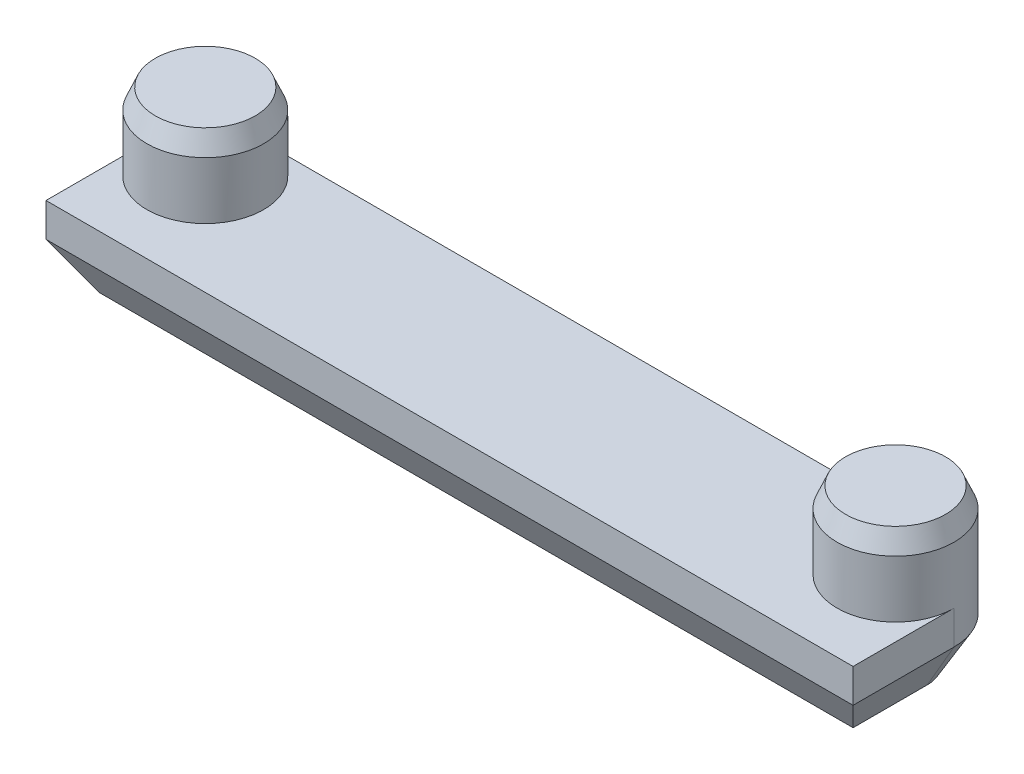
ISO-10303-21;
HEADER;
FILE_DESCRIPTION(('STEP AP214'),'2;1');
FILE_NAME('part.step','',(''),(''),'','','');
FILE_SCHEMA(('AUTOMOTIVE_DESIGN { 1 0 10303 214 1 1 1 1 }'));
ENDSEC;
DATA;
#1=APPLICATION_CONTEXT('core data for automotive mechanical design processes');
#2=APPLICATION_PROTOCOL_DEFINITION('international standard','automotive_design',2000,#1);
#3=PRODUCT_CONTEXT('',#1,'mechanical');
#4=PRODUCT('Part','Part','',(#3));
#5=PRODUCT_RELATED_PRODUCT_CATEGORY('part','',(#4));
#6=PRODUCT_DEFINITION_FORMATION('','',#4);
#7=PRODUCT_DEFINITION_CONTEXT('part definition',#1,'design');
#8=PRODUCT_DEFINITION('design','',#6,#7);
#9=PRODUCT_DEFINITION_SHAPE('','',#8);
#10=(LENGTH_UNIT() NAMED_UNIT(*) SI_UNIT(.MILLI.,.METRE.));
#11=(NAMED_UNIT(*) PLANE_ANGLE_UNIT() SI_UNIT($,.RADIAN.));
#12=(NAMED_UNIT(*) SI_UNIT($,.STERADIAN.) SOLID_ANGLE_UNIT());
#13=UNCERTAINTY_MEASURE_WITH_UNIT(LENGTH_MEASURE(1.E-05),#10,'distance_accuracy_value','');
#14=(GEOMETRIC_REPRESENTATION_CONTEXT(3) GLOBAL_UNCERTAINTY_ASSIGNED_CONTEXT((#13)) GLOBAL_UNIT_ASSIGNED_CONTEXT((#10,
#11,#12)) REPRESENTATION_CONTEXT('',''));
#15=CARTESIAN_POINT('',(0.,0.,0.));
#16=DIRECTION('',(0.,0.,1.));
#17=DIRECTION('',(1.,0.,0.));
#18=AXIS2_PLACEMENT_3D('',#15,#16,#17);
#19=CARTESIAN_POINT('',(30.4,3.,0.));
#20=DIRECTION('',(-1.,0.,0.));
#21=DIRECTION('',(0.,0.,1.));
#22=AXIS2_PLACEMENT_3D('',#19,#20,#21);
#23=PLANE('',#22);
#24=DIRECTION('',(0.,-1.,0.));
#25=VECTOR('',#24,1.);
#26=CARTESIAN_POINT('',(30.4,3.,0.));
#27=LINE('',#26,#25);
#28=CARTESIAN_POINT('',(30.4,3.,0.));
#29=VERTEX_POINT('',#28);
#30=CARTESIAN_POINT('',(30.4,1.73205080756888,0.));
#31=VERTEX_POINT('',#30);
#32=EDGE_CURVE('E200',#29,#31,#27,.T.);
#33=ORIENTED_EDGE('',*,*,#32,.T.);
#34=DIRECTION('',(0.,0.,-1.));
#35=VECTOR('',#34,1.);
#36=CARTESIAN_POINT('',(30.4,1.73205080756888,-3.8));
#37=LINE('',#36,#35);
#38=CARTESIAN_POINT('',(30.4,1.73205080756888,-3.8));
#39=VERTEX_POINT('',#38);
#40=EDGE_CURVE('E116',#31,#39,#37,.T.);
#41=ORIENTED_EDGE('',*,*,#40,.T.);
#42=DIRECTION('',(0.,1.,0.));
#43=VECTOR('',#42,1.);
#44=CARTESIAN_POINT('',(30.4,0.,-3.8));
#45=LINE('',#44,#43);
#46=CARTESIAN_POINT('',(30.4,3.,-3.8));
#47=VERTEX_POINT('',#46);
#48=EDGE_CURVE('E111',#39,#47,#45,.T.);
#49=ORIENTED_EDGE('',*,*,#48,.T.);
#50=DIRECTION('',(0.,0.,-1.));
#51=VECTOR('',#50,1.);
#52=CARTESIAN_POINT('',(30.4,3.,0.));
#53=LINE('',#52,#51);
#54=EDGE_CURVE('E114',#29,#47,#53,.T.);
#55=ORIENTED_EDGE('',*,*,#54,.F.);
#56=EDGE_LOOP('',(#33,#41,#49,#55));
#57=FACE_BOUND('',#56,.T.);
#58=ADVANCED_FACE('F40',(#57),#23,.F.);
#59=CARTESIAN_POINT('',(0.,3.,-6.));
#60=DIRECTION('',(0.,0.,1.));
#61=DIRECTION('',(1.,0.,0.));
#62=AXIS2_PLACEMENT_3D('',#59,#60,#61);
#63=PLANE('',#62);
#64=DIRECTION('',(0.,1.,0.));
#65=VECTOR('',#64,1.);
#66=CARTESIAN_POINT('',(28.2,0.,-6.));
#67=LINE('',#66,#65);
#68=CARTESIAN_POINT('',(28.2,1.73205080756888,-6.));
#69=VERTEX_POINT('',#68);
#70=CARTESIAN_POINT('',(28.2,3.,-6.));
#71=VERTEX_POINT('',#70);
#72=EDGE_CURVE('E118',#69,#71,#67,.T.);
#73=ORIENTED_EDGE('',*,*,#72,.F.);
#74=DIRECTION('',(-1.,0.,0.));
#75=VECTOR('',#74,1.);
#76=CARTESIAN_POINT('',(2.2,1.73205080756888,-6.));
#77=LINE('',#76,#75);
#78=CARTESIAN_POINT('',(2.2,1.73205080756888,-6.));
#79=VERTEX_POINT('',#78);
#80=EDGE_CURVE('E11',#69,#79,#77,.T.);
#81=ORIENTED_EDGE('',*,*,#80,.T.);
#82=DIRECTION('',(0.,1.,0.));
#83=VECTOR('',#82,1.);
#84=CARTESIAN_POINT('',(2.2,0.,-6.));
#85=LINE('',#84,#83);
#86=CARTESIAN_POINT('',(2.2,3.,-6.));
#87=VERTEX_POINT('',#86);
#88=EDGE_CURVE('E189',#79,#87,#85,.T.);
#89=ORIENTED_EDGE('',*,*,#88,.T.);
#90=DIRECTION('',(-1.,0.,0.));
#91=VECTOR('',#90,1.);
#92=CARTESIAN_POINT('',(0.,3.,-6.));
#93=LINE('',#92,#91);
#94=EDGE_CURVE('E129',#71,#87,#93,.T.);
#95=ORIENTED_EDGE('',*,*,#94,.F.);
#96=EDGE_LOOP('',(#73,#81,#89,#95));
#97=FACE_BOUND('',#96,.T.);
#98=ADVANCED_FACE('F233',(#97),#63,.F.);
#99=CARTESIAN_POINT('',(0.,3.,0.));
#100=DIRECTION('',(0.,-1.,0.));
#101=DIRECTION('',(0.,0.,-1.));
#102=AXIS2_PLACEMENT_3D('',#99,#100,#101);
#103=PLANE('',#102);
#104=CARTESIAN_POINT('',(28.2,3.,-3.8));
#105=DIRECTION('',(0.,-1.,0.));
#106=DIRECTION('',(0.,0.,-1.));
#107=AXIS2_PLACEMENT_3D('',#104,#105,#106);
#108=CIRCLE('',#107,2.2);
#109=EDGE_CURVE('E125',#71,#47,#108,.F.);
#110=ORIENTED_EDGE('',*,*,#109,.F.);
#111=ORIENTED_EDGE('',*,*,#94,.T.);
#112=CARTESIAN_POINT('',(2.2,3.,-3.8));
#113=DIRECTION('',(0.,1.,0.));
#114=DIRECTION('',(0.,0.,1.));
#115=AXIS2_PLACEMENT_3D('',#112,#113,#114);
#116=CIRCLE('',#115,2.2);
#117=CARTESIAN_POINT('',(0.,3.,-3.8));
#118=VERTEX_POINT('',#117);
#119=EDGE_CURVE('E134',#118,#87,#116,.T.);
#120=ORIENTED_EDGE('',*,*,#119,.F.);
#121=DIRECTION('',(0.,0.,1.));
#122=VECTOR('',#121,1.);
#123=CARTESIAN_POINT('',(0.,3.,0.));
#124=LINE('',#123,#122);
#125=CARTESIAN_POINT('',(0.,3.,0.));
#126=VERTEX_POINT('',#125);
#127=EDGE_CURVE('E197',#118,#126,#124,.T.);
#128=ORIENTED_EDGE('',*,*,#127,.T.);
#129=DIRECTION('',(1.,0.,0.));
#130=VECTOR('',#129,1.);
#131=CARTESIAN_POINT('',(0.,3.,0.));
#132=LINE('',#131,#130);
#133=EDGE_CURVE('E127',#126,#29,#132,.T.);
#134=ORIENTED_EDGE('',*,*,#133,.T.);
#135=ORIENTED_EDGE('',*,*,#54,.T.);
#136=EDGE_LOOP('',(#110,#111,#120,#128,#134,#135));
#137=FACE_BOUND('',#136,.T.);
#138=ADVANCED_FACE('F123',(#137),#103,.F.);
#139=CARTESIAN_POINT('',(0.,3.,0.));
#140=DIRECTION('',(1.,0.,0.));
#141=DIRECTION('',(0.,0.,-1.));
#142=AXIS2_PLACEMENT_3D('',#139,#140,#141);
#143=PLANE('',#142);
#144=DIRECTION('',(0.,1.,0.));
#145=VECTOR('',#144,1.);
#146=CARTESIAN_POINT('',(0.,0.,-3.8));
#147=LINE('',#146,#145);
#148=CARTESIAN_POINT('',(0.,1.73205080756888,-3.8));
#149=VERTEX_POINT('',#148);
#150=EDGE_CURVE('E119',#149,#118,#147,.T.);
#151=ORIENTED_EDGE('',*,*,#150,.F.);
#152=DIRECTION('',(0.,0.,1.));
#153=VECTOR('',#152,1.);
#154=CARTESIAN_POINT('',(0.,1.73205080756888,0.));
#155=LINE('',#154,#153);
#156=CARTESIAN_POINT('',(0.,1.73205080756888,0.));
#157=VERTEX_POINT('',#156);
#158=EDGE_CURVE('E170',#149,#157,#155,.T.);
#159=ORIENTED_EDGE('',*,*,#158,.T.);
#160=DIRECTION('',(0.,-1.,0.));
#161=VECTOR('',#160,1.);
#162=CARTESIAN_POINT('',(0.,3.,0.));
#163=LINE('',#162,#161);
#164=EDGE_CURVE('E140',#126,#157,#163,.T.);
#165=ORIENTED_EDGE('',*,*,#164,.F.);
#166=ORIENTED_EDGE('',*,*,#127,.F.);
#167=EDGE_LOOP('',(#151,#159,#165,#166));
#168=FACE_BOUND('',#167,.T.);
#169=ADVANCED_FACE('F232',(#168),#143,.F.);
#170=CARTESIAN_POINT('',(0.,3.,0.));
#171=DIRECTION('',(0.,0.,-1.));
#172=DIRECTION('',(-1.,0.,0.));
#173=AXIS2_PLACEMENT_3D('',#170,#171,#172);
#174=PLANE('',#173);
#175=ORIENTED_EDGE('',*,*,#164,.T.);
#176=DIRECTION('',(1.,0.,0.));
#177=VECTOR('',#176,1.);
#178=CARTESIAN_POINT('',(30.4,1.73205080756888,0.));
#179=LINE('',#178,#177);
#180=EDGE_CURVE('E153',#157,#31,#179,.T.);
#181=ORIENTED_EDGE('',*,*,#180,.T.);
#182=ORIENTED_EDGE('',*,*,#32,.F.);
#183=ORIENTED_EDGE('',*,*,#133,.F.);
#184=EDGE_LOOP('',(#175,#181,#182,#183));
#185=FACE_BOUND('',#184,.T.);
#186=ADVANCED_FACE('F205',(#185),#174,.F.);
#187=CARTESIAN_POINT('',(0.,0.,0.));
#188=DIRECTION('',(0.,-1.,0.));
#189=DIRECTION('',(0.,0.,-1.));
#190=AXIS2_PLACEMENT_3D('',#187,#188,#189);
#191=PLANE('',#190);
#192=DIRECTION('',(0.,0.,1.));
#193=VECTOR('',#192,1.);
#194=CARTESIAN_POINT('',(29.4,0.,0.));
#195=LINE('',#194,#193);
#196=CARTESIAN_POINT('',(29.4,0.,-3.8));
#197=VERTEX_POINT('',#196);
#198=CARTESIAN_POINT('',(29.4,0.,-1.));
#199=VERTEX_POINT('',#198);
#200=EDGE_CURVE('E164',#197,#199,#195,.T.);
#201=ORIENTED_EDGE('',*,*,#200,.T.);
#202=DIRECTION('',(-1.,0.,0.));
#203=VECTOR('',#202,1.);
#204=CARTESIAN_POINT('',(0.,0.,-1.));
#205=LINE('',#204,#203);
#206=CARTESIAN_POINT('',(1.,0.,-1.));
#207=VERTEX_POINT('',#206);
#208=EDGE_CURVE('E166',#199,#207,#205,.T.);
#209=ORIENTED_EDGE('',*,*,#208,.T.);
#210=DIRECTION('',(0.,0.,-1.));
#211=VECTOR('',#210,1.);
#212=CARTESIAN_POINT('',(1.,0.,-3.8));
#213=LINE('',#212,#211);
#214=CARTESIAN_POINT('',(1.,0.,-3.8));
#215=VERTEX_POINT('',#214);
#216=EDGE_CURVE('E162',#207,#215,#213,.T.);
#217=ORIENTED_EDGE('',*,*,#216,.T.);
#218=CARTESIAN_POINT('',(2.2,0.,-3.8));
#219=DIRECTION('',(0.,-1.,0.));
#220=DIRECTION('',(0.,0.,-1.));
#221=AXIS2_PLACEMENT_3D('',#218,#219,#220);
#222=CIRCLE('',#221,1.2);
#223=CARTESIAN_POINT('',(2.2,0.,-5.));
#224=VERTEX_POINT('',#223);
#225=EDGE_CURVE('E158',#215,#224,#222,.T.);
#226=ORIENTED_EDGE('',*,*,#225,.T.);
#227=DIRECTION('',(1.,0.,0.));
#228=VECTOR('',#227,1.);
#229=CARTESIAN_POINT('',(28.2,0.,-5.));
#230=LINE('',#229,#228);
#231=CARTESIAN_POINT('',(28.2,0.,-5.));
#232=VERTEX_POINT('',#231);
#233=EDGE_CURVE('E156',#224,#232,#230,.T.);
#234=ORIENTED_EDGE('',*,*,#233,.T.);
#235=CARTESIAN_POINT('',(28.2,0.,-3.8));
#236=DIRECTION('',(0.,-1.,0.));
#237=DIRECTION('',(0.,0.,-1.));
#238=AXIS2_PLACEMENT_3D('',#235,#236,#237);
#239=CIRCLE('',#238,1.19999999999999);
#240=EDGE_CURVE('E160',#232,#197,#239,.T.);
#241=ORIENTED_EDGE('',*,*,#240,.T.);
#242=EDGE_LOOP('',(#201,#209,#217,#226,#234,#241));
#243=FACE_BOUND('',#242,.T.);
#244=ADVANCED_FACE('F223',(#243),#191,.T.);
#245=CARTESIAN_POINT('',(2.2,5.9,-3.8));
#246=DIRECTION('',(0.,-1.,0.));
#247=DIRECTION('',(0.,0.,-1.));
#248=AXIS2_PLACEMENT_3D('',#245,#246,#247);
#249=CYLINDRICAL_SURFACE('',#248,2.2);
#250=CARTESIAN_POINT('',(2.2,5.14999999999997,-3.8));
#251=DIRECTION('',(0.,1.,0.));
#252=DIRECTION('',(0.,0.,1.));
#253=AXIS2_PLACEMENT_3D('',#250,#251,#252);
#254=CIRCLE('',#253,2.2);
#255=CARTESIAN_POINT('',(2.2,5.14999999999997,-1.6));
#256=VERTEX_POINT('',#255);
#257=EDGE_CURVE('E150',#256,#256,#254,.F.);
#258=ORIENTED_EDGE('',*,*,#257,.T.);
#259=EDGE_LOOP('',(#258));
#260=FACE_BOUND('',#259,.T.);
#261=ORIENTED_EDGE('',*,*,#88,.F.);
#262=CARTESIAN_POINT('',(2.2,1.73205080756888,-3.8));
#263=DIRECTION('',(0.,-1.,0.));
#264=DIRECTION('',(0.,0.,-1.));
#265=AXIS2_PLACEMENT_3D('',#262,#263,#264);
#266=CIRCLE('',#265,2.2);
#267=EDGE_CURVE('E49',#79,#149,#266,.F.);
#268=ORIENTED_EDGE('',*,*,#267,.T.);
#269=ORIENTED_EDGE('',*,*,#150,.T.);
#270=ORIENTED_EDGE('',*,*,#119,.T.);
#271=EDGE_LOOP('',(#261,#268,#269,#270));
#272=FACE_BOUND('',#271,.T.);
#273=ADVANCED_FACE('F230',(#260,#272),#249,.T.);
#274=CARTESIAN_POINT('',(2.2,5.9,-3.8));
#275=DIRECTION('',(0.,1.,0.));
#276=DIRECTION('',(0.,0.,1.));
#277=AXIS2_PLACEMENT_3D('',#274,#275,#276);
#278=PLANE('',#277);
#279=CARTESIAN_POINT('',(2.2,5.9,-3.8));
#280=DIRECTION('',(0.,1.,0.));
#281=DIRECTION('',(0.,0.,1.));
#282=AXIS2_PLACEMENT_3D('',#279,#280,#281);
#283=CIRCLE('',#282,1.88164388784279);
#284=CARTESIAN_POINT('',(2.2,5.9,-1.91835611215721));
#285=VERTEX_POINT('',#284);
#286=EDGE_CURVE('E147',#285,#285,#283,.T.);
#287=ORIENTED_EDGE('',*,*,#286,.T.);
#288=EDGE_LOOP('',(#287));
#289=FACE_BOUND('',#288,.T.);
#290=ADVANCED_FACE('F294',(#289),#278,.T.);
#291=CARTESIAN_POINT('',(28.2,5.9,-3.8));
#292=DIRECTION('',(0.,-1.,0.));
#293=DIRECTION('',(0.,0.,-1.));
#294=AXIS2_PLACEMENT_3D('',#291,#292,#293);
#295=CYLINDRICAL_SURFACE('',#294,2.2);
#296=CARTESIAN_POINT('',(28.2,5.14999999999998,-3.8));
#297=DIRECTION('',(0.,1.,0.));
#298=DIRECTION('',(0.,0.,1.));
#299=AXIS2_PLACEMENT_3D('',#296,#297,#298);
#300=CIRCLE('',#299,2.2);
#301=CARTESIAN_POINT('',(28.2,5.14999999999998,-1.6));
#302=VERTEX_POINT('',#301);
#303=EDGE_CURVE('E137',#302,#302,#300,.F.);
#304=ORIENTED_EDGE('',*,*,#303,.T.);
#305=EDGE_LOOP('',(#304));
#306=FACE_BOUND('',#305,.T.);
#307=ORIENTED_EDGE('',*,*,#48,.F.);
#308=CARTESIAN_POINT('',(28.2,1.73205080756888,-3.8));
#309=DIRECTION('',(0.,-1.,0.));
#310=DIRECTION('',(0.,0.,-1.));
#311=AXIS2_PLACEMENT_3D('',#308,#309,#310);
#312=CIRCLE('',#311,2.2);
#313=EDGE_CURVE('E63',#39,#69,#312,.F.);
#314=ORIENTED_EDGE('',*,*,#313,.T.);
#315=ORIENTED_EDGE('',*,*,#72,.T.);
#316=ORIENTED_EDGE('',*,*,#109,.T.);
#317=EDGE_LOOP('',(#307,#314,#315,#316));
#318=FACE_BOUND('',#317,.T.);
#319=ADVANCED_FACE('F131',(#306,#318),#295,.T.);
#320=CARTESIAN_POINT('',(28.2,5.9,-3.8));
#321=DIRECTION('',(0.,1.,0.));
#322=DIRECTION('',(0.,0.,1.));
#323=AXIS2_PLACEMENT_3D('',#320,#321,#322);
#324=PLANE('',#323);
#325=CARTESIAN_POINT('',(28.2,5.9,-3.8));
#326=DIRECTION('',(0.,1.,0.));
#327=DIRECTION('',(0.,0.,1.));
#328=AXIS2_PLACEMENT_3D('',#325,#326,#327);
#329=CIRCLE('',#328,1.88164388784279);
#330=CARTESIAN_POINT('',(28.2,5.9,-1.91835611215721));
#331=VERTEX_POINT('',#330);
#332=EDGE_CURVE('E133',#331,#331,#329,.T.);
#333=ORIENTED_EDGE('',*,*,#332,.T.);
#334=EDGE_LOOP('',(#333));
#335=FACE_BOUND('',#334,.T.);
#336=ADVANCED_FACE('F253',(#335),#324,.T.);
#337=CARTESIAN_POINT('',(28.2,5.9,-3.8));
#338=DIRECTION('',(0.,-1.,0.));
#339=DIRECTION('',(0.,0.,-1.));
#340=AXIS2_PLACEMENT_3D('',#337,#338,#339);
#341=CONICAL_SURFACE('',#340,1.88164388784279,0.401425727958693);
#342=ORIENTED_EDGE('',*,*,#303,.F.);
#343=EDGE_LOOP('',(#342));
#344=FACE_BOUND('',#343,.T.);
#345=ORIENTED_EDGE('',*,*,#332,.F.);
#346=EDGE_LOOP('',(#345));
#347=FACE_BOUND('',#346,.T.);
#348=ADVANCED_FACE('F249',(#344,#347),#341,.T.);
#349=CARTESIAN_POINT('',(2.2,5.9,-3.8));
#350=DIRECTION('',(0.,-1.,0.));
#351=DIRECTION('',(0.,0.,-1.));
#352=AXIS2_PLACEMENT_3D('',#349,#350,#351);
#353=CONICAL_SURFACE('',#352,1.88164388784279,0.401425727958692);
#354=ORIENTED_EDGE('',*,*,#257,.F.);
#355=EDGE_LOOP('',(#354));
#356=FACE_BOUND('',#355,.T.);
#357=ORIENTED_EDGE('',*,*,#286,.F.);
#358=EDGE_LOOP('',(#357));
#359=FACE_BOUND('',#358,.T.);
#360=ADVANCED_FACE('F252',(#356,#359),#353,.T.);
#361=CARTESIAN_POINT('',(0.,1.73205080756888,-6.));
#362=DIRECTION('',(0.,-0.500000000000001,-0.866025403784438));
#363=DIRECTION('',(1.,0.,0.));
#364=AXIS2_PLACEMENT_3D('',#361,#362,#363);
#365=PLANE('',#364);
#366=DIRECTION('',(0.,0.866025403784438,-0.500000000000001));
#367=VECTOR('',#366,1.);
#368=CARTESIAN_POINT('',(28.2,0.,-5.));
#369=LINE('',#368,#367);
#370=EDGE_CURVE('E183',#232,#69,#369,.T.);
#371=ORIENTED_EDGE('',*,*,#370,.F.);
#372=ORIENTED_EDGE('',*,*,#233,.F.);
#373=DIRECTION('',(0.,-0.866025403784438,0.500000000000001));
#374=VECTOR('',#373,1.);
#375=CARTESIAN_POINT('',(2.2,1.73205080756888,-6.));
#376=LINE('',#375,#374);
#377=EDGE_CURVE('E44',#79,#224,#376,.T.);
#378=ORIENTED_EDGE('',*,*,#377,.F.);
#379=ORIENTED_EDGE('',*,*,#80,.F.);
#380=EDGE_LOOP('',(#371,#372,#378,#379));
#381=FACE_BOUND('',#380,.T.);
#382=ADVANCED_FACE('F42',(#381),#365,.T.);
#383=CARTESIAN_POINT('',(2.2,0.,-3.8));
#384=DIRECTION('',(0.,1.,0.));
#385=DIRECTION('',(0.,0.,1.));
#386=AXIS2_PLACEMENT_3D('',#383,#384,#385);
#387=CONICAL_SURFACE('',#386,1.2,0.523598775598301);
#388=ORIENTED_EDGE('',*,*,#377,.T.);
#389=ORIENTED_EDGE('',*,*,#225,.F.);
#390=DIRECTION('',(0.500000000000002,-0.866025403784438,0.));
#391=VECTOR('',#390,1.);
#392=CARTESIAN_POINT('',(0.,1.73205080756888,-3.8));
#393=LINE('',#392,#391);
#394=EDGE_CURVE('E181',#149,#215,#393,.T.);
#395=ORIENTED_EDGE('',*,*,#394,.F.);
#396=ORIENTED_EDGE('',*,*,#267,.F.);
#397=EDGE_LOOP('',(#388,#389,#395,#396));
#398=FACE_BOUND('',#397,.T.);
#399=ADVANCED_FACE('F227',(#398),#387,.T.);
#400=CARTESIAN_POINT('',(28.2,0.,-3.8));
#401=DIRECTION('',(0.,1.,0.));
#402=DIRECTION('',(0.,0.,1.));
#403=AXIS2_PLACEMENT_3D('',#400,#401,#402);
#404=CONICAL_SURFACE('',#403,1.19999999999999,0.523598775598301);
#405=ORIENTED_EDGE('',*,*,#370,.T.);
#406=ORIENTED_EDGE('',*,*,#313,.F.);
#407=DIRECTION('',(0.500000000000001,0.866025403784438,0.));
#408=VECTOR('',#407,1.);
#409=CARTESIAN_POINT('',(29.4,0.,-3.8));
#410=LINE('',#409,#408);
#411=EDGE_CURVE('E178',#197,#39,#410,.T.);
#412=ORIENTED_EDGE('',*,*,#411,.F.);
#413=ORIENTED_EDGE('',*,*,#240,.F.);
#414=EDGE_LOOP('',(#405,#406,#412,#413));
#415=FACE_BOUND('',#414,.T.);
#416=ADVANCED_FACE('F221',(#415),#404,.T.);
#417=CARTESIAN_POINT('',(0.,1.73205080756888,0.));
#418=DIRECTION('',(-0.866025403784438,-0.500000000000001,0.));
#419=DIRECTION('',(0.,0.,-1.));
#420=AXIS2_PLACEMENT_3D('',#417,#418,#419);
#421=PLANE('',#420);
#422=ORIENTED_EDGE('',*,*,#394,.T.);
#423=ORIENTED_EDGE('',*,*,#216,.F.);
#424=DIRECTION('',(-0.447213595499959,0.774596669241482,0.447213595499959));
#425=VECTOR('',#424,1.);
#426=CARTESIAN_POINT('',(0.,1.73205080756888,0.));
#427=LINE('',#426,#425);
#428=EDGE_CURVE('E176',#157,#207,#427,.F.);
#429=ORIENTED_EDGE('',*,*,#428,.F.);
#430=ORIENTED_EDGE('',*,*,#158,.F.);
#431=EDGE_LOOP('',(#422,#423,#429,#430));
#432=FACE_BOUND('',#431,.T.);
#433=ADVANCED_FACE('F212',(#432),#421,.T.);
#434=CARTESIAN_POINT('',(30.4,1.73205080756888,0.));
#435=DIRECTION('',(0.866025403784438,-0.500000000000001,0.));
#436=DIRECTION('',(0.,0.,1.));
#437=AXIS2_PLACEMENT_3D('',#434,#435,#436);
#438=PLANE('',#437);
#439=ORIENTED_EDGE('',*,*,#411,.T.);
#440=ORIENTED_EDGE('',*,*,#40,.F.);
#441=DIRECTION('',(-0.447213595499959,-0.774596669241482,-0.447213595499959));
#442=VECTOR('',#441,1.);
#443=CARTESIAN_POINT('',(30.4,1.73205080756888,0.));
#444=LINE('',#443,#442);
#445=EDGE_CURVE('E174',#199,#31,#444,.F.);
#446=ORIENTED_EDGE('',*,*,#445,.F.);
#447=ORIENTED_EDGE('',*,*,#200,.F.);
#448=EDGE_LOOP('',(#439,#440,#446,#447));
#449=FACE_BOUND('',#448,.T.);
#450=ADVANCED_FACE('F219',(#449),#438,.T.);
#451=CARTESIAN_POINT('',(0.,1.73205080756888,0.));
#452=DIRECTION('',(0.,-0.500000000000001,0.866025403784438));
#453=DIRECTION('',(-1.,0.,0.));
#454=AXIS2_PLACEMENT_3D('',#451,#452,#453);
#455=PLANE('',#454);
#456=ORIENTED_EDGE('',*,*,#428,.T.);
#457=ORIENTED_EDGE('',*,*,#208,.F.);
#458=ORIENTED_EDGE('',*,*,#445,.T.);
#459=ORIENTED_EDGE('',*,*,#180,.F.);
#460=EDGE_LOOP('',(#456,#457,#458,#459));
#461=FACE_BOUND('',#460,.T.);
#462=ADVANCED_FACE('F215',(#461),#455,.T.);
#463=CLOSED_SHELL('',(#58,#98,#138,#169,#186,#244,#273,#290,#319,#336,#348,#360,#382,#399,#416,
#433,#450,#462));
#464=MANIFOLD_SOLID_BREP('B2',#463);
#465=ADVANCED_BREP_SHAPE_REPRESENTATION('',(#18,#464),#14);
#466=SHAPE_DEFINITION_REPRESENTATION(#9,#465);
ENDSEC;
END-ISO-10303-21;
